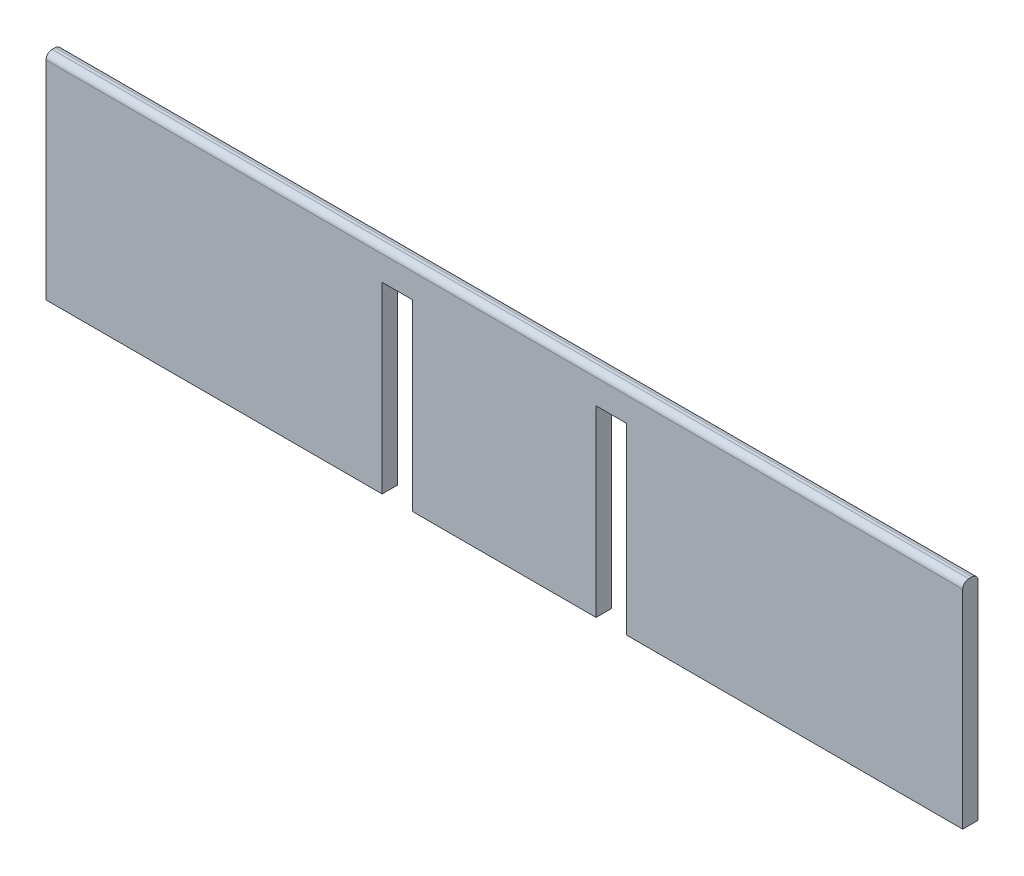
ISO-10303-21;
HEADER;
FILE_DESCRIPTION(('STEP AP214'),'2;1');
FILE_NAME('part.step','',(''),(''),'','','');
FILE_SCHEMA(('AUTOMOTIVE_DESIGN { 1 0 10303 214 1 1 1 1 }'));
ENDSEC;
DATA;
#1=APPLICATION_CONTEXT('core data for automotive mechanical design processes');
#2=APPLICATION_PROTOCOL_DEFINITION('international standard','automotive_design',2000,#1);
#3=PRODUCT_CONTEXT('',#1,'mechanical');
#4=PRODUCT('Part','Part','',(#3));
#5=PRODUCT_RELATED_PRODUCT_CATEGORY('part','',(#4));
#6=PRODUCT_DEFINITION_FORMATION('','',#4);
#7=PRODUCT_DEFINITION_CONTEXT('part definition',#1,'design');
#8=PRODUCT_DEFINITION('design','',#6,#7);
#9=PRODUCT_DEFINITION_SHAPE('','',#8);
#10=(LENGTH_UNIT() NAMED_UNIT(*) SI_UNIT(.MILLI.,.METRE.));
#11=(NAMED_UNIT(*) PLANE_ANGLE_UNIT() SI_UNIT($,.RADIAN.));
#12=(NAMED_UNIT(*) SI_UNIT($,.STERADIAN.) SOLID_ANGLE_UNIT());
#13=UNCERTAINTY_MEASURE_WITH_UNIT(LENGTH_MEASURE(1.E-05),#10,'distance_accuracy_value','');
#14=(GEOMETRIC_REPRESENTATION_CONTEXT(3) GLOBAL_UNCERTAINTY_ASSIGNED_CONTEXT((#13)) GLOBAL_UNIT_ASSIGNED_CONTEXT((#10,
#11,#12)) REPRESENTATION_CONTEXT('',''));
#15=CARTESIAN_POINT('',(0.,0.,0.));
#16=DIRECTION('',(0.,0.,1.));
#17=DIRECTION('',(1.,0.,0.));
#18=AXIS2_PLACEMENT_3D('',#15,#16,#17);
#19=CARTESIAN_POINT('',(150.,-35.,5.));
#20=DIRECTION('',(0.,1.,0.));
#21=DIRECTION('',(-1.,0.,0.));
#22=AXIS2_PLACEMENT_3D('',#19,#20,#21);
#23=PLANE('',#22);
#24=DIRECTION('',(1.,0.,0.));
#25=VECTOR('',#24,1.);
#26=CARTESIAN_POINT('',(150.,-35.,0.));
#27=LINE('',#26,#25);
#28=CARTESIAN_POINT('',(-30.,-35.,0.));
#29=VERTEX_POINT('',#28);
#30=CARTESIAN_POINT('',(30.,-35.,0.));
#31=VERTEX_POINT('',#30);
#32=EDGE_CURVE('E240',#29,#31,#27,.T.);
#33=ORIENTED_EDGE('',*,*,#32,.T.);
#34=DIRECTION('',(0.,0.,-1.));
#35=VECTOR('',#34,1.);
#36=CARTESIAN_POINT('',(30.,-35.,5.));
#37=LINE('',#36,#35);
#38=CARTESIAN_POINT('',(30.,-35.,5.));
#39=VERTEX_POINT('',#38);
#40=EDGE_CURVE('E177',#39,#31,#37,.T.);
#41=ORIENTED_EDGE('',*,*,#40,.F.);
#42=DIRECTION('',(1.,0.,0.));
#43=VECTOR('',#42,1.);
#44=CARTESIAN_POINT('',(150.,-35.,5.));
#45=LINE('',#44,#43);
#46=CARTESIAN_POINT('',(-30.,-35.,5.));
#47=VERTEX_POINT('',#46);
#48=EDGE_CURVE('E162',#47,#39,#45,.T.);
#49=ORIENTED_EDGE('',*,*,#48,.F.);
#50=DIRECTION('',(0.,0.,-1.));
#51=VECTOR('',#50,1.);
#52=CARTESIAN_POINT('',(-30.,-35.,5.));
#53=LINE('',#52,#51);
#54=EDGE_CURVE('E174',#47,#29,#53,.T.);
#55=ORIENTED_EDGE('',*,*,#54,.T.);
#56=EDGE_LOOP('',(#33,#41,#49,#55));
#57=FACE_BOUND('',#56,.T.);
#58=ADVANCED_FACE('F38',(#57),#23,.F.);
#59=CARTESIAN_POINT('',(40.,-35.,5.));
#60=VERTEX_POINT('',#59);
#61=CARTESIAN_POINT('',(150.,-35.,5.));
#62=VERTEX_POINT('',#61);
#63=EDGE_CURVE('E222',#60,#62,#45,.T.);
#64=ORIENTED_EDGE('',*,*,#63,.F.);
#65=DIRECTION('',(0.,0.,-1.));
#66=VECTOR('',#65,1.);
#67=CARTESIAN_POINT('',(40.,-35.,5.));
#68=LINE('',#67,#66);
#69=CARTESIAN_POINT('',(40.,-35.,0.));
#70=VERTEX_POINT('',#69);
#71=EDGE_CURVE('E181',#60,#70,#68,.T.);
#72=ORIENTED_EDGE('',*,*,#71,.T.);
#73=CARTESIAN_POINT('',(150.,-35.,0.));
#74=VERTEX_POINT('',#73);
#75=EDGE_CURVE('E235',#70,#74,#27,.T.);
#76=ORIENTED_EDGE('',*,*,#75,.T.);
#77=DIRECTION('',(0.,0.,-1.));
#78=VECTOR('',#77,1.);
#79=CARTESIAN_POINT('',(150.,-35.,5.));
#80=LINE('',#79,#78);
#81=EDGE_CURVE('E249',#62,#74,#80,.T.);
#82=ORIENTED_EDGE('',*,*,#81,.F.);
#83=EDGE_LOOP('',(#64,#72,#76,#82));
#84=FACE_BOUND('',#83,.T.);
#85=ADVANCED_FACE('F317',(#84),#23,.F.);
#86=CARTESIAN_POINT('',(-150.,-35.,5.));
#87=DIRECTION('',(1.,0.,0.));
#88=DIRECTION('',(0.,0.,-1.));
#89=AXIS2_PLACEMENT_3D('',#86,#87,#88);
#90=PLANE('',#89);
#91=DIRECTION('',(0.,-1.,0.));
#92=VECTOR('',#91,1.);
#93=CARTESIAN_POINT('',(-150.,-35.,5.));
#94=LINE('',#93,#92);
#95=CARTESIAN_POINT('',(-150.,33.,5.));
#96=VERTEX_POINT('',#95);
#97=CARTESIAN_POINT('',(-150.,-35.,5.));
#98=VERTEX_POINT('',#97);
#99=EDGE_CURVE('E219',#96,#98,#94,.T.);
#100=ORIENTED_EDGE('',*,*,#99,.F.);
#101=CARTESIAN_POINT('',(-150.,33.,3.));
#102=DIRECTION('',(1.,0.,0.));
#103=DIRECTION('',(0.,0.,-1.));
#104=AXIS2_PLACEMENT_3D('',#101,#102,#103);
#105=CIRCLE('',#104,2.);
#106=CARTESIAN_POINT('',(-150.,35.,3.));
#107=VERTEX_POINT('',#106);
#108=EDGE_CURVE('E275',#96,#107,#105,.F.);
#109=ORIENTED_EDGE('',*,*,#108,.T.);
#110=DIRECTION('',(0.,0.,-1.));
#111=VECTOR('',#110,1.);
#112=CARTESIAN_POINT('',(-150.,35.,5.));
#113=LINE('',#112,#111);
#114=CARTESIAN_POINT('',(-150.,35.,2.));
#115=VERTEX_POINT('',#114);
#116=EDGE_CURVE('E232',#107,#115,#113,.T.);
#117=ORIENTED_EDGE('',*,*,#116,.T.);
#118=CARTESIAN_POINT('',(-150.,33.,2.));
#119=DIRECTION('',(1.,0.,0.));
#120=DIRECTION('',(0.,0.,-1.));
#121=AXIS2_PLACEMENT_3D('',#118,#119,#120);
#122=CIRCLE('',#121,2.);
#123=CARTESIAN_POINT('',(-150.,33.,0.));
#124=VERTEX_POINT('',#123);
#125=EDGE_CURVE('E261',#115,#124,#122,.F.);
#126=ORIENTED_EDGE('',*,*,#125,.T.);
#127=DIRECTION('',(0.,-1.,0.));
#128=VECTOR('',#127,1.);
#129=CARTESIAN_POINT('',(-150.,-35.,0.));
#130=LINE('',#129,#128);
#131=CARTESIAN_POINT('',(-150.,-35.,0.));
#132=VERTEX_POINT('',#131);
#133=EDGE_CURVE('E180',#124,#132,#130,.T.);
#134=ORIENTED_EDGE('',*,*,#133,.T.);
#135=DIRECTION('',(0.,0.,-1.));
#136=VECTOR('',#135,1.);
#137=CARTESIAN_POINT('',(-150.,-35.,5.));
#138=LINE('',#137,#136);
#139=EDGE_CURVE('E253',#98,#132,#138,.T.);
#140=ORIENTED_EDGE('',*,*,#139,.F.);
#141=EDGE_LOOP('',(#100,#109,#117,#126,#134,#140));
#142=FACE_BOUND('',#141,.T.);
#143=ADVANCED_FACE('F295',(#142),#90,.F.);
#144=CARTESIAN_POINT('',(-40.,-35.,0.));
#145=VERTEX_POINT('',#144);
#146=EDGE_CURVE('E236',#132,#145,#27,.T.);
#147=ORIENTED_EDGE('',*,*,#146,.T.);
#148=DIRECTION('',(0.,0.,-1.));
#149=VECTOR('',#148,1.);
#150=CARTESIAN_POINT('',(-40.,-35.,5.));
#151=LINE('',#150,#149);
#152=CARTESIAN_POINT('',(-40.,-35.,5.));
#153=VERTEX_POINT('',#152);
#154=EDGE_CURVE('E62',#153,#145,#151,.T.);
#155=ORIENTED_EDGE('',*,*,#154,.F.);
#156=EDGE_CURVE('E224',#98,#153,#45,.T.);
#157=ORIENTED_EDGE('',*,*,#156,.F.);
#158=ORIENTED_EDGE('',*,*,#139,.T.);
#159=EDGE_LOOP('',(#147,#155,#157,#158));
#160=FACE_BOUND('',#159,.T.);
#161=ADVANCED_FACE('F299',(#160),#23,.F.);
#162=CARTESIAN_POINT('',(150.,-35.,5.));
#163=DIRECTION('',(-1.,0.,0.));
#164=DIRECTION('',(0.,0.,1.));
#165=AXIS2_PLACEMENT_3D('',#162,#163,#164);
#166=PLANE('',#165);
#167=DIRECTION('',(0.,0.,-1.));
#168=VECTOR('',#167,1.);
#169=CARTESIAN_POINT('',(150.,35.,5.));
#170=LINE('',#169,#168);
#171=CARTESIAN_POINT('',(150.,35.,3.));
#172=VERTEX_POINT('',#171);
#173=CARTESIAN_POINT('',(150.,35.,2.));
#174=VERTEX_POINT('',#173);
#175=EDGE_CURVE('E246',#172,#174,#170,.T.);
#176=ORIENTED_EDGE('',*,*,#175,.F.);
#177=CARTESIAN_POINT('',(150.,33.,3.));
#178=DIRECTION('',(-1.,0.,0.));
#179=DIRECTION('',(0.,0.,1.));
#180=AXIS2_PLACEMENT_3D('',#177,#178,#179);
#181=CIRCLE('',#180,2.);
#182=CARTESIAN_POINT('',(150.,33.,5.));
#183=VERTEX_POINT('',#182);
#184=EDGE_CURVE('E11',#172,#183,#181,.F.);
#185=ORIENTED_EDGE('',*,*,#184,.T.);
#186=DIRECTION('',(0.,1.,0.));
#187=VECTOR('',#186,1.);
#188=CARTESIAN_POINT('',(150.,-35.,5.));
#189=LINE('',#188,#187);
#190=EDGE_CURVE('E228',#62,#183,#189,.T.);
#191=ORIENTED_EDGE('',*,*,#190,.F.);
#192=ORIENTED_EDGE('',*,*,#81,.T.);
#193=DIRECTION('',(0.,1.,0.));
#194=VECTOR('',#193,1.);
#195=CARTESIAN_POINT('',(150.,-35.,0.));
#196=LINE('',#195,#194);
#197=CARTESIAN_POINT('',(150.,33.,0.));
#198=VERTEX_POINT('',#197);
#199=EDGE_CURVE('E223',#74,#198,#196,.T.);
#200=ORIENTED_EDGE('',*,*,#199,.T.);
#201=CARTESIAN_POINT('',(150.,33.,2.));
#202=DIRECTION('',(-1.,0.,0.));
#203=DIRECTION('',(0.,0.,1.));
#204=AXIS2_PLACEMENT_3D('',#201,#202,#203);
#205=CIRCLE('',#204,2.);
#206=EDGE_CURVE('E267',#198,#174,#205,.F.);
#207=ORIENTED_EDGE('',*,*,#206,.T.);
#208=EDGE_LOOP('',(#176,#185,#191,#192,#200,#207));
#209=FACE_BOUND('',#208,.T.);
#210=ADVANCED_FACE('F286',(#209),#166,.F.);
#211=CARTESIAN_POINT('',(150.,35.,5.));
#212=DIRECTION('',(0.,-1.,0.));
#213=DIRECTION('',(1.,0.,0.));
#214=AXIS2_PLACEMENT_3D('',#211,#212,#213);
#215=PLANE('',#214);
#216=ORIENTED_EDGE('',*,*,#116,.F.);
#217=DIRECTION('',(-1.,0.,0.));
#218=VECTOR('',#217,1.);
#219=CARTESIAN_POINT('',(150.,35.,3.));
#220=LINE('',#219,#218);
#221=EDGE_CURVE('E47',#107,#172,#220,.F.);
#222=ORIENTED_EDGE('',*,*,#221,.T.);
#223=ORIENTED_EDGE('',*,*,#175,.T.);
#224=DIRECTION('',(-1.,0.,0.));
#225=VECTOR('',#224,1.);
#226=CARTESIAN_POINT('',(150.,35.,2.));
#227=LINE('',#226,#225);
#228=EDGE_CURVE('E257',#174,#115,#227,.T.);
#229=ORIENTED_EDGE('',*,*,#228,.T.);
#230=EDGE_LOOP('',(#216,#222,#223,#229));
#231=FACE_BOUND('',#230,.T.);
#232=ADVANCED_FACE('F282',(#231),#215,.F.);
#233=CARTESIAN_POINT('',(0.,0.,5.));
#234=DIRECTION('',(0.,0.,1.));
#235=DIRECTION('',(1.,0.,0.));
#236=AXIS2_PLACEMENT_3D('',#233,#234,#235);
#237=PLANE('',#236);
#238=DIRECTION('',(0.,1.,0.));
#239=VECTOR('',#238,1.);
#240=CARTESIAN_POINT('',(30.,-35.,5.));
#241=LINE('',#240,#239);
#242=CARTESIAN_POINT('',(30.,25.,5.));
#243=VERTEX_POINT('',#242);
#244=EDGE_CURVE('E141',#39,#243,#241,.T.);
#245=ORIENTED_EDGE('',*,*,#244,.T.);
#246=DIRECTION('',(1.,0.,0.));
#247=VECTOR('',#246,1.);
#248=CARTESIAN_POINT('',(30.,25.,5.));
#249=LINE('',#248,#247);
#250=CARTESIAN_POINT('',(40.,25.,5.));
#251=VERTEX_POINT('',#250);
#252=EDGE_CURVE('E151',#243,#251,#249,.T.);
#253=ORIENTED_EDGE('',*,*,#252,.T.);
#254=DIRECTION('',(0.,-1.,0.));
#255=VECTOR('',#254,1.);
#256=CARTESIAN_POINT('',(40.,-35.,5.));
#257=LINE('',#256,#255);
#258=EDGE_CURVE('E148',#251,#60,#257,.T.);
#259=ORIENTED_EDGE('',*,*,#258,.T.);
#260=ORIENTED_EDGE('',*,*,#63,.T.);
#261=ORIENTED_EDGE('',*,*,#190,.T.);
#262=DIRECTION('',(-1.,0.,0.));
#263=VECTOR('',#262,1.);
#264=CARTESIAN_POINT('',(-150.,33.,5.));
#265=LINE('',#264,#263);
#266=EDGE_CURVE('E271',#183,#96,#265,.T.);
#267=ORIENTED_EDGE('',*,*,#266,.T.);
#268=ORIENTED_EDGE('',*,*,#99,.T.);
#269=ORIENTED_EDGE('',*,*,#156,.T.);
#270=DIRECTION('',(0.,1.,0.));
#271=VECTOR('',#270,1.);
#272=CARTESIAN_POINT('',(-40.,-35.,5.));
#273=LINE('',#272,#271);
#274=CARTESIAN_POINT('',(-40.,25.,5.));
#275=VERTEX_POINT('',#274);
#276=EDGE_CURVE('E187',#153,#275,#273,.T.);
#277=ORIENTED_EDGE('',*,*,#276,.T.);
#278=DIRECTION('',(1.,0.,0.));
#279=VECTOR('',#278,1.);
#280=CARTESIAN_POINT('',(-30.,25.,5.));
#281=LINE('',#280,#279);
#282=CARTESIAN_POINT('',(-30.,25.,5.));
#283=VERTEX_POINT('',#282);
#284=EDGE_CURVE('E191',#275,#283,#281,.T.);
#285=ORIENTED_EDGE('',*,*,#284,.T.);
#286=DIRECTION('',(0.,-1.,0.));
#287=VECTOR('',#286,1.);
#288=CARTESIAN_POINT('',(-30.,-35.,5.));
#289=LINE('',#288,#287);
#290=EDGE_CURVE('E196',#283,#47,#289,.T.);
#291=ORIENTED_EDGE('',*,*,#290,.T.);
#292=ORIENTED_EDGE('',*,*,#48,.T.);
#293=EDGE_LOOP('',(#245,#253,#259,#260,#261,#267,#268,#269,#277,#285,#291,#292));
#294=FACE_BOUND('',#293,.T.);
#295=ADVANCED_FACE('F159',(#294),#237,.T.);
#296=CARTESIAN_POINT('',(0.,0.,0.));
#297=DIRECTION('',(0.,0.,1.));
#298=DIRECTION('',(1.,0.,0.));
#299=AXIS2_PLACEMENT_3D('',#296,#297,#298);
#300=PLANE('',#299);
#301=DIRECTION('',(1.,0.,0.));
#302=VECTOR('',#301,1.);
#303=CARTESIAN_POINT('',(30.,25.,0.));
#304=LINE('',#303,#302);
#305=CARTESIAN_POINT('',(30.,25.,0.));
#306=VERTEX_POINT('',#305);
#307=CARTESIAN_POINT('',(40.,25.,0.));
#308=VERTEX_POINT('',#307);
#309=EDGE_CURVE('E167',#306,#308,#304,.T.);
#310=ORIENTED_EDGE('',*,*,#309,.F.);
#311=DIRECTION('',(0.,1.,0.));
#312=VECTOR('',#311,1.);
#313=CARTESIAN_POINT('',(30.,-35.,0.));
#314=LINE('',#313,#312);
#315=EDGE_CURVE('E54',#31,#306,#314,.T.);
#316=ORIENTED_EDGE('',*,*,#315,.F.);
#317=ORIENTED_EDGE('',*,*,#32,.F.);
#318=DIRECTION('',(0.,-1.,0.));
#319=VECTOR('',#318,1.);
#320=CARTESIAN_POINT('',(-30.,-35.,0.));
#321=LINE('',#320,#319);
#322=CARTESIAN_POINT('',(-30.,25.,0.));
#323=VERTEX_POINT('',#322);
#324=EDGE_CURVE('E192',#323,#29,#321,.T.);
#325=ORIENTED_EDGE('',*,*,#324,.F.);
#326=DIRECTION('',(1.,0.,0.));
#327=VECTOR('',#326,1.);
#328=CARTESIAN_POINT('',(-30.,25.,0.));
#329=LINE('',#328,#327);
#330=CARTESIAN_POINT('',(-40.,25.,0.));
#331=VERTEX_POINT('',#330);
#332=EDGE_CURVE('E202',#331,#323,#329,.T.);
#333=ORIENTED_EDGE('',*,*,#332,.F.);
#334=DIRECTION('',(0.,1.,0.));
#335=VECTOR('',#334,1.);
#336=CARTESIAN_POINT('',(-40.,-35.,0.));
#337=LINE('',#336,#335);
#338=EDGE_CURVE('E199',#145,#331,#337,.T.);
#339=ORIENTED_EDGE('',*,*,#338,.F.);
#340=ORIENTED_EDGE('',*,*,#146,.F.);
#341=ORIENTED_EDGE('',*,*,#133,.F.);
#342=DIRECTION('',(-1.,0.,0.));
#343=VECTOR('',#342,1.);
#344=CARTESIAN_POINT('',(0.,33.,0.));
#345=LINE('',#344,#343);
#346=EDGE_CURVE('E264',#124,#198,#345,.F.);
#347=ORIENTED_EDGE('',*,*,#346,.T.);
#348=ORIENTED_EDGE('',*,*,#199,.F.);
#349=ORIENTED_EDGE('',*,*,#75,.F.);
#350=DIRECTION('',(0.,-1.,0.));
#351=VECTOR('',#350,1.);
#352=CARTESIAN_POINT('',(40.,-35.,0.));
#353=LINE('',#352,#351);
#354=EDGE_CURVE('E164',#308,#70,#353,.T.);
#355=ORIENTED_EDGE('',*,*,#354,.F.);
#356=EDGE_LOOP('',(#310,#316,#317,#325,#333,#339,#340,#341,#347,#348,#349,#355));
#357=FACE_BOUND('',#356,.T.);
#358=ADVANCED_FACE('F321',(#357),#300,.F.);
#359=CARTESIAN_POINT('',(150.,33.,2.));
#360=DIRECTION('',(-1.,0.,0.));
#361=DIRECTION('',(0.,-1.,0.));
#362=AXIS2_PLACEMENT_3D('',#359,#360,#361);
#363=CYLINDRICAL_SURFACE('',#362,2.);
#364=ORIENTED_EDGE('',*,*,#206,.F.);
#365=ORIENTED_EDGE('',*,*,#346,.F.);
#366=ORIENTED_EDGE('',*,*,#125,.F.);
#367=ORIENTED_EDGE('',*,*,#228,.F.);
#368=EDGE_LOOP('',(#364,#365,#366,#367));
#369=FACE_BOUND('',#368,.T.);
#370=ADVANCED_FACE('F326',(#369),#363,.T.);
#371=CARTESIAN_POINT('',(0.,33.,3.));
#372=DIRECTION('',(1.,0.,0.));
#373=DIRECTION('',(0.,1.,0.));
#374=AXIS2_PLACEMENT_3D('',#371,#372,#373);
#375=CYLINDRICAL_SURFACE('',#374,2.);
#376=ORIENTED_EDGE('',*,*,#184,.F.);
#377=ORIENTED_EDGE('',*,*,#221,.F.);
#378=ORIENTED_EDGE('',*,*,#108,.F.);
#379=ORIENTED_EDGE('',*,*,#266,.F.);
#380=EDGE_LOOP('',(#376,#377,#378,#379));
#381=FACE_BOUND('',#380,.T.);
#382=ADVANCED_FACE('F40',(#381),#375,.T.);
#383=CARTESIAN_POINT('',(-30.,-35.,5.));
#384=DIRECTION('',(1.,0.,0.));
#385=DIRECTION('',(0.,1.,0.));
#386=AXIS2_PLACEMENT_3D('',#383,#384,#385);
#387=PLANE('',#386);
#388=ORIENTED_EDGE('',*,*,#324,.T.);
#389=ORIENTED_EDGE('',*,*,#54,.F.);
#390=ORIENTED_EDGE('',*,*,#290,.F.);
#391=DIRECTION('',(0.,0.,-1.));
#392=VECTOR('',#391,1.);
#393=CARTESIAN_POINT('',(-30.,25.,5.));
#394=LINE('',#393,#392);
#395=EDGE_CURVE('E211',#283,#323,#394,.T.);
#396=ORIENTED_EDGE('',*,*,#395,.T.);
#397=EDGE_LOOP('',(#388,#389,#390,#396));
#398=FACE_BOUND('',#397,.T.);
#399=ADVANCED_FACE('F308',(#398),#387,.F.);
#400=CARTESIAN_POINT('',(-30.,25.,5.));
#401=DIRECTION('',(0.,1.,0.));
#402=DIRECTION('',(-1.,0.,0.));
#403=AXIS2_PLACEMENT_3D('',#400,#401,#402);
#404=PLANE('',#403);
#405=ORIENTED_EDGE('',*,*,#332,.T.);
#406=ORIENTED_EDGE('',*,*,#395,.F.);
#407=ORIENTED_EDGE('',*,*,#284,.F.);
#408=DIRECTION('',(0.,0.,-1.));
#409=VECTOR('',#408,1.);
#410=CARTESIAN_POINT('',(-40.,25.,5.));
#411=LINE('',#410,#409);
#412=EDGE_CURVE('E214',#275,#331,#411,.T.);
#413=ORIENTED_EDGE('',*,*,#412,.T.);
#414=EDGE_LOOP('',(#405,#406,#407,#413));
#415=FACE_BOUND('',#414,.T.);
#416=ADVANCED_FACE('F304',(#415),#404,.F.);
#417=CARTESIAN_POINT('',(-40.,-35.,5.));
#418=DIRECTION('',(-1.,0.,0.));
#419=DIRECTION('',(0.,-1.,0.));
#420=AXIS2_PLACEMENT_3D('',#417,#418,#419);
#421=PLANE('',#420);
#422=ORIENTED_EDGE('',*,*,#338,.T.);
#423=ORIENTED_EDGE('',*,*,#412,.F.);
#424=ORIENTED_EDGE('',*,*,#276,.F.);
#425=ORIENTED_EDGE('',*,*,#154,.T.);
#426=EDGE_LOOP('',(#422,#423,#424,#425));
#427=FACE_BOUND('',#426,.T.);
#428=ADVANCED_FACE('F301',(#427),#421,.F.);
#429=CARTESIAN_POINT('',(30.,-35.,5.));
#430=DIRECTION('',(-1.,0.,0.));
#431=DIRECTION('',(0.,0.,1.));
#432=AXIS2_PLACEMENT_3D('',#429,#430,#431);
#433=PLANE('',#432);
#434=ORIENTED_EDGE('',*,*,#315,.T.);
#435=DIRECTION('',(0.,0.,-1.));
#436=VECTOR('',#435,1.);
#437=CARTESIAN_POINT('',(30.,25.,5.));
#438=LINE('',#437,#436);
#439=EDGE_CURVE('E137',#243,#306,#438,.T.);
#440=ORIENTED_EDGE('',*,*,#439,.F.);
#441=ORIENTED_EDGE('',*,*,#244,.F.);
#442=ORIENTED_EDGE('',*,*,#40,.T.);
#443=EDGE_LOOP('',(#434,#440,#441,#442));
#444=FACE_BOUND('',#443,.T.);
#445=ADVANCED_FACE('F139',(#444),#433,.F.);
#446=CARTESIAN_POINT('',(40.,-35.,5.));
#447=DIRECTION('',(1.,0.,0.));
#448=DIRECTION('',(0.,1.,0.));
#449=AXIS2_PLACEMENT_3D('',#446,#447,#448);
#450=PLANE('',#449);
#451=ORIENTED_EDGE('',*,*,#354,.T.);
#452=ORIENTED_EDGE('',*,*,#71,.F.);
#453=ORIENTED_EDGE('',*,*,#258,.F.);
#454=DIRECTION('',(0.,0.,-1.));
#455=VECTOR('',#454,1.);
#456=CARTESIAN_POINT('',(40.,25.,5.));
#457=LINE('',#456,#455);
#458=EDGE_CURVE('E147',#251,#308,#457,.T.);
#459=ORIENTED_EDGE('',*,*,#458,.T.);
#460=EDGE_LOOP('',(#451,#452,#453,#459));
#461=FACE_BOUND('',#460,.T.);
#462=ADVANCED_FACE('F409',(#461),#450,.F.);
#463=CARTESIAN_POINT('',(30.,25.,5.));
#464=DIRECTION('',(0.,1.,0.));
#465=DIRECTION('',(0.,0.,1.));
#466=AXIS2_PLACEMENT_3D('',#463,#464,#465);
#467=PLANE('',#466);
#468=ORIENTED_EDGE('',*,*,#309,.T.);
#469=ORIENTED_EDGE('',*,*,#458,.F.);
#470=ORIENTED_EDGE('',*,*,#252,.F.);
#471=ORIENTED_EDGE('',*,*,#439,.T.);
#472=EDGE_LOOP('',(#468,#469,#470,#471));
#473=FACE_BOUND('',#472,.T.);
#474=ADVANCED_FACE('F152',(#473),#467,.F.);
#475=CLOSED_SHELL('',(#58,#85,#143,#161,#210,#232,#295,#358,#370,#382,#399,#416,#428,#445,#462,#474));
#476=MANIFOLD_SOLID_BREP('B2',#475);
#477=ADVANCED_BREP_SHAPE_REPRESENTATION('',(#18,#476),#14);
#478=SHAPE_DEFINITION_REPRESENTATION(#9,#477);
ENDSEC;
END-ISO-10303-21;
